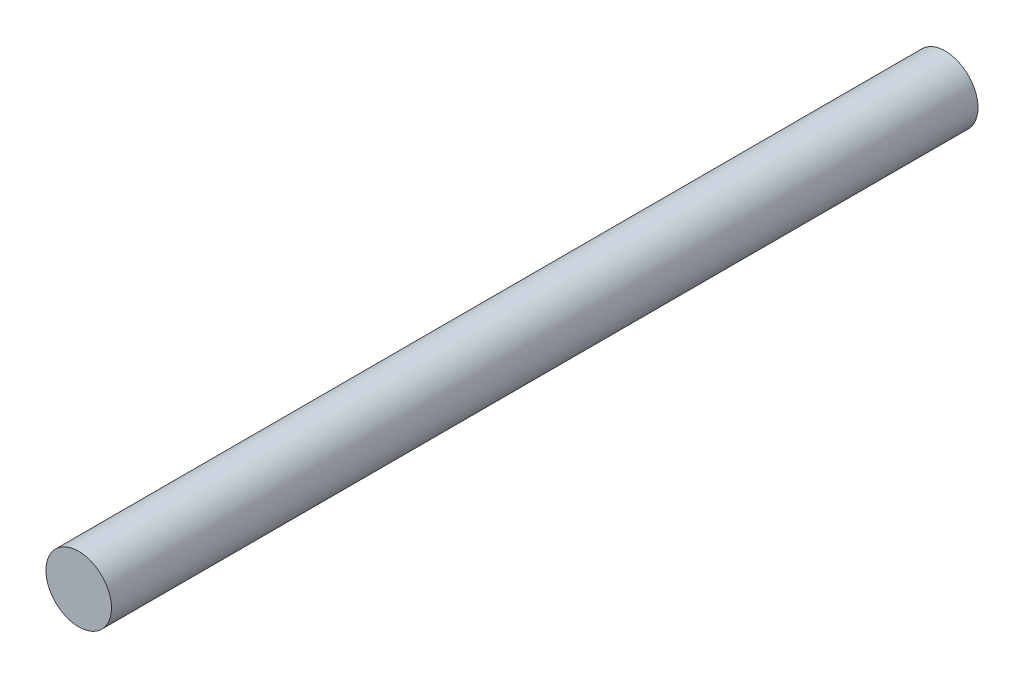
ISO-10303-21;
HEADER;
FILE_DESCRIPTION(('STEP AP214'),'2;1');
FILE_NAME('part.step','',(''),(''),'','','');
FILE_SCHEMA(('AUTOMOTIVE_DESIGN { 1 0 10303 214 1 1 1 1 }'));
ENDSEC;
DATA;
#1=APPLICATION_CONTEXT('core data for automotive mechanical design processes');
#2=APPLICATION_PROTOCOL_DEFINITION('international standard','automotive_design',2000,#1);
#3=PRODUCT_CONTEXT('',#1,'mechanical');
#4=PRODUCT('Part','Part','',(#3));
#5=PRODUCT_RELATED_PRODUCT_CATEGORY('part','',(#4));
#6=PRODUCT_DEFINITION_FORMATION('','',#4);
#7=PRODUCT_DEFINITION_CONTEXT('part definition',#1,'design');
#8=PRODUCT_DEFINITION('design','',#6,#7);
#9=PRODUCT_DEFINITION_SHAPE('','',#8);
#10=(LENGTH_UNIT() NAMED_UNIT(*) SI_UNIT(.MILLI.,.METRE.));
#11=(NAMED_UNIT(*) PLANE_ANGLE_UNIT() SI_UNIT($,.RADIAN.));
#12=(NAMED_UNIT(*) SI_UNIT($,.STERADIAN.) SOLID_ANGLE_UNIT());
#13=UNCERTAINTY_MEASURE_WITH_UNIT(LENGTH_MEASURE(1.E-05),#10,'distance_accuracy_value','');
#14=(GEOMETRIC_REPRESENTATION_CONTEXT(3) GLOBAL_UNCERTAINTY_ASSIGNED_CONTEXT((#13)) GLOBAL_UNIT_ASSIGNED_CONTEXT((#10,
#11,#12)) REPRESENTATION_CONTEXT('',''));
#15=CARTESIAN_POINT('',(0.,0.,0.));
#16=DIRECTION('',(0.,0.,1.));
#17=DIRECTION('',(1.,0.,0.));
#18=AXIS2_PLACEMENT_3D('',#15,#16,#17);
#19=CARTESIAN_POINT('',(0.,0.,197.));
#20=DIRECTION('',(0.,0.,-1.));
#21=DIRECTION('',(-1.,0.,0.));
#22=AXIS2_PLACEMENT_3D('',#19,#20,#21);
#23=CYLINDRICAL_SURFACE('',#22,7.45);
#24=CARTESIAN_POINT('',(0.,0.,197.));
#25=DIRECTION('',(0.,0.,1.));
#26=DIRECTION('',(1.,0.,0.));
#27=AXIS2_PLACEMENT_3D('',#24,#25,#26);
#28=CIRCLE('',#27,7.45);
#29=CARTESIAN_POINT('',(7.45,0.,197.));
#30=VERTEX_POINT('',#29);
#31=EDGE_CURVE('E10',#30,#30,#28,.T.);
#32=ORIENTED_EDGE('',*,*,#31,.F.);
#33=EDGE_LOOP('',(#32));
#34=FACE_BOUND('',#33,.T.);
#35=CARTESIAN_POINT('',(0.,0.,0.));
#36=DIRECTION('',(0.,0.,1.));
#37=DIRECTION('',(1.,0.,0.));
#38=AXIS2_PLACEMENT_3D('',#35,#36,#37);
#39=CIRCLE('',#38,7.45);
#40=CARTESIAN_POINT('',(7.45,0.,0.));
#41=VERTEX_POINT('',#40);
#42=EDGE_CURVE('E40',#41,#41,#39,.T.);
#43=ORIENTED_EDGE('',*,*,#42,.T.);
#44=EDGE_LOOP('',(#43));
#45=FACE_BOUND('',#44,.T.);
#46=ADVANCED_FACE('F37',(#34,#45),#23,.T.);
#47=CARTESIAN_POINT('',(0.,0.,197.));
#48=DIRECTION('',(0.,0.,1.));
#49=DIRECTION('',(1.,0.,0.));
#50=AXIS2_PLACEMENT_3D('',#47,#48,#49);
#51=PLANE('',#50);
#52=ORIENTED_EDGE('',*,*,#31,.T.);
#53=EDGE_LOOP('',(#52));
#54=FACE_BOUND('',#53,.T.);
#55=ADVANCED_FACE('F52',(#54),#51,.T.);
#56=CARTESIAN_POINT('',(0.,0.,0.));
#57=DIRECTION('',(0.,0.,1.));
#58=DIRECTION('',(1.,0.,0.));
#59=AXIS2_PLACEMENT_3D('',#56,#57,#58);
#60=PLANE('',#59);
#61=ORIENTED_EDGE('',*,*,#42,.F.);
#62=EDGE_LOOP('',(#61));
#63=FACE_BOUND('',#62,.T.);
#64=ADVANCED_FACE('F50',(#63),#60,.F.);
#65=CLOSED_SHELL('',(#46,#55,#64));
#66=MANIFOLD_SOLID_BREP('B2',#65);
#67=ADVANCED_BREP_SHAPE_REPRESENTATION('',(#18,#66),#14);
#68=SHAPE_DEFINITION_REPRESENTATION(#9,#67);
ENDSEC;
END-ISO-10303-21;
